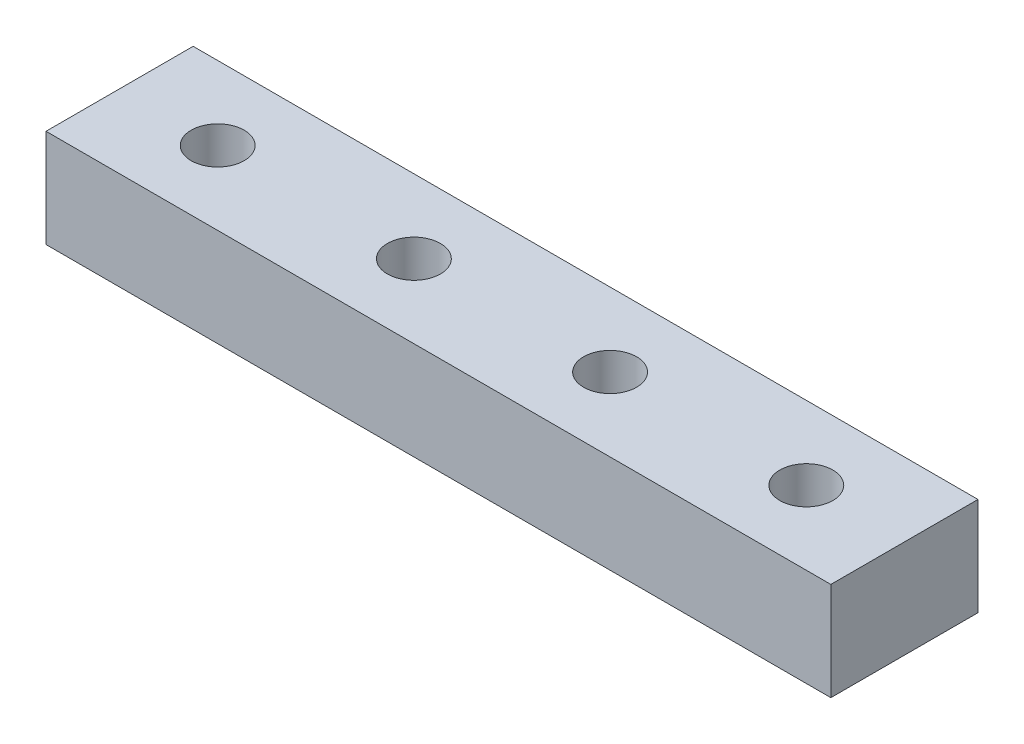
ISO-10303-21;
HEADER;
FILE_DESCRIPTION(('STEP AP214'),'2;1');
FILE_NAME('part.step','',(''),(''),'','','');
FILE_SCHEMA(('AUTOMOTIVE_DESIGN { 1 0 10303 214 1 1 1 1 }'));
ENDSEC;
DATA;
#1=APPLICATION_CONTEXT('core data for automotive mechanical design processes');
#2=APPLICATION_PROTOCOL_DEFINITION('international standard','automotive_design',2000,#1);
#3=PRODUCT_CONTEXT('',#1,'mechanical');
#4=PRODUCT('Part','Part','',(#3));
#5=PRODUCT_RELATED_PRODUCT_CATEGORY('part','',(#4));
#6=PRODUCT_DEFINITION_FORMATION('','',#4);
#7=PRODUCT_DEFINITION_CONTEXT('part definition',#1,'design');
#8=PRODUCT_DEFINITION('design','',#6,#7);
#9=PRODUCT_DEFINITION_SHAPE('','',#8);
#10=(LENGTH_UNIT() NAMED_UNIT(*) SI_UNIT(.MILLI.,.METRE.));
#11=(NAMED_UNIT(*) PLANE_ANGLE_UNIT() SI_UNIT($,.RADIAN.));
#12=(NAMED_UNIT(*) SI_UNIT($,.STERADIAN.) SOLID_ANGLE_UNIT());
#13=UNCERTAINTY_MEASURE_WITH_UNIT(LENGTH_MEASURE(1.E-05),#10,'distance_accuracy_value','');
#14=(GEOMETRIC_REPRESENTATION_CONTEXT(3) GLOBAL_UNCERTAINTY_ASSIGNED_CONTEXT((#13)) GLOBAL_UNIT_ASSIGNED_CONTEXT((#10,
#11,#12)) REPRESENTATION_CONTEXT('',''));
#15=CARTESIAN_POINT('',(0.,0.,0.));
#16=DIRECTION('',(0.,0.,1.));
#17=DIRECTION('',(1.,0.,0.));
#18=AXIS2_PLACEMENT_3D('',#15,#16,#17);
#19=CARTESIAN_POINT('',(-50.8,12.7,-19.05));
#20=DIRECTION('',(1.,0.,0.));
#21=DIRECTION('',(0.,0.,-1.));
#22=AXIS2_PLACEMENT_3D('',#19,#20,#21);
#23=PLANE('',#22);
#24=DIRECTION('',(0.,0.,1.));
#25=VECTOR('',#24,1.);
#26=CARTESIAN_POINT('',(-50.8,0.,-19.05));
#27=LINE('',#26,#25);
#28=CARTESIAN_POINT('',(-50.8,0.,-19.05));
#29=VERTEX_POINT('',#28);
#30=CARTESIAN_POINT('',(-50.8,0.,0.));
#31=VERTEX_POINT('',#30);
#32=EDGE_CURVE('E99',#29,#31,#27,.T.);
#33=ORIENTED_EDGE('',*,*,#32,.T.);
#34=DIRECTION('',(0.,-1.,0.));
#35=VECTOR('',#34,1.);
#36=CARTESIAN_POINT('',(-50.8,12.7,0.));
#37=LINE('',#36,#35);
#38=CARTESIAN_POINT('',(-50.8,12.7,0.));
#39=VERTEX_POINT('',#38);
#40=EDGE_CURVE('E11',#39,#31,#37,.T.);
#41=ORIENTED_EDGE('',*,*,#40,.F.);
#42=DIRECTION('',(0.,0.,1.));
#43=VECTOR('',#42,1.);
#44=CARTESIAN_POINT('',(-50.8,12.7,-19.05));
#45=LINE('',#44,#43);
#46=CARTESIAN_POINT('',(-50.8,12.7,-19.05));
#47=VERTEX_POINT('',#46);
#48=EDGE_CURVE('E86',#47,#39,#45,.T.);
#49=ORIENTED_EDGE('',*,*,#48,.F.);
#50=DIRECTION('',(0.,-1.,0.));
#51=VECTOR('',#50,1.);
#52=CARTESIAN_POINT('',(-50.8,12.7,-19.05));
#53=LINE('',#52,#51);
#54=EDGE_CURVE('E95',#47,#29,#53,.T.);
#55=ORIENTED_EDGE('',*,*,#54,.T.);
#56=EDGE_LOOP('',(#33,#41,#49,#55));
#57=FACE_BOUND('',#56,.T.);
#58=ADVANCED_FACE('F33',(#57),#23,.F.);
#59=CARTESIAN_POINT('',(-50.8,12.7,0.));
#60=DIRECTION('',(0.,0.,-1.));
#61=DIRECTION('',(-1.,0.,0.));
#62=AXIS2_PLACEMENT_3D('',#59,#60,#61);
#63=PLANE('',#62);
#64=DIRECTION('',(1.,0.,0.));
#65=VECTOR('',#64,1.);
#66=CARTESIAN_POINT('',(-50.8,0.,0.));
#67=LINE('',#66,#65);
#68=CARTESIAN_POINT('',(50.8,0.,0.));
#69=VERTEX_POINT('',#68);
#70=EDGE_CURVE('E90',#31,#69,#67,.T.);
#71=ORIENTED_EDGE('',*,*,#70,.T.);
#72=DIRECTION('',(0.,-1.,0.));
#73=VECTOR('',#72,1.);
#74=CARTESIAN_POINT('',(50.8,12.7,0.));
#75=LINE('',#74,#73);
#76=CARTESIAN_POINT('',(50.8,12.7,0.));
#77=VERTEX_POINT('',#76);
#78=EDGE_CURVE('E42',#77,#69,#75,.T.);
#79=ORIENTED_EDGE('',*,*,#78,.F.);
#80=DIRECTION('',(1.,0.,0.));
#81=VECTOR('',#80,1.);
#82=CARTESIAN_POINT('',(-50.8,12.7,0.));
#83=LINE('',#82,#81);
#84=EDGE_CURVE('E81',#39,#77,#83,.T.);
#85=ORIENTED_EDGE('',*,*,#84,.F.);
#86=ORIENTED_EDGE('',*,*,#40,.T.);
#87=EDGE_LOOP('',(#71,#79,#85,#86));
#88=FACE_BOUND('',#87,.T.);
#89=ADVANCED_FACE('F89',(#88),#63,.F.);
#90=CARTESIAN_POINT('',(50.8,12.7,-19.05));
#91=DIRECTION('',(-1.,0.,0.));
#92=DIRECTION('',(0.,0.,1.));
#93=AXIS2_PLACEMENT_3D('',#90,#91,#92);
#94=PLANE('',#93);
#95=DIRECTION('',(0.,0.,-1.));
#96=VECTOR('',#95,1.);
#97=CARTESIAN_POINT('',(50.8,0.,-19.05));
#98=LINE('',#97,#96);
#99=CARTESIAN_POINT('',(50.8,0.,-19.05));
#100=VERTEX_POINT('',#99);
#101=EDGE_CURVE('E68',#69,#100,#98,.T.);
#102=ORIENTED_EDGE('',*,*,#101,.T.);
#103=DIRECTION('',(0.,-1.,0.));
#104=VECTOR('',#103,1.);
#105=CARTESIAN_POINT('',(50.8,12.7,-19.05));
#106=LINE('',#105,#104);
#107=CARTESIAN_POINT('',(50.8,12.7,-19.05));
#108=VERTEX_POINT('',#107);
#109=EDGE_CURVE('E91',#108,#100,#106,.T.);
#110=ORIENTED_EDGE('',*,*,#109,.F.);
#111=DIRECTION('',(0.,0.,-1.));
#112=VECTOR('',#111,1.);
#113=CARTESIAN_POINT('',(50.8,12.7,-19.05));
#114=LINE('',#113,#112);
#115=EDGE_CURVE('E84',#77,#108,#114,.T.);
#116=ORIENTED_EDGE('',*,*,#115,.F.);
#117=ORIENTED_EDGE('',*,*,#78,.T.);
#118=EDGE_LOOP('',(#102,#110,#116,#117));
#119=FACE_BOUND('',#118,.T.);
#120=ADVANCED_FACE('F93',(#119),#94,.F.);
#121=CARTESIAN_POINT('',(-50.8,12.7,-19.05));
#122=DIRECTION('',(0.,0.,1.));
#123=DIRECTION('',(1.,0.,0.));
#124=AXIS2_PLACEMENT_3D('',#121,#122,#123);
#125=PLANE('',#124);
#126=DIRECTION('',(-1.,0.,0.));
#127=VECTOR('',#126,1.);
#128=CARTESIAN_POINT('',(-50.8,0.,-19.05));
#129=LINE('',#128,#127);
#130=EDGE_CURVE('E74',#100,#29,#129,.T.);
#131=ORIENTED_EDGE('',*,*,#130,.T.);
#132=ORIENTED_EDGE('',*,*,#54,.F.);
#133=DIRECTION('',(-1.,0.,0.));
#134=VECTOR('',#133,1.);
#135=CARTESIAN_POINT('',(-50.8,12.7,-19.05));
#136=LINE('',#135,#134);
#137=EDGE_CURVE('E51',#108,#47,#136,.T.);
#138=ORIENTED_EDGE('',*,*,#137,.F.);
#139=ORIENTED_EDGE('',*,*,#109,.T.);
#140=EDGE_LOOP('',(#131,#132,#138,#139));
#141=FACE_BOUND('',#140,.T.);
#142=ADVANCED_FACE('F145',(#141),#125,.F.);
#143=CARTESIAN_POINT('',(0.,12.7,0.));
#144=DIRECTION('',(0.,1.,0.));
#145=DIRECTION('',(0.,0.,1.));
#146=AXIS2_PLACEMENT_3D('',#143,#144,#145);
#147=PLANE('',#146);
#148=CARTESIAN_POINT('',(38.1,12.7,-9.52499999999999));
#149=DIRECTION('',(0.,1.,0.));
#150=DIRECTION('',(0.,0.,1.));
#151=AXIS2_PLACEMENT_3D('',#148,#149,#150);
#152=CIRCLE('',#151,3.429);
#153=CARTESIAN_POINT('',(38.1,12.7,-6.09599999999999));
#154=VERTEX_POINT('',#153);
#155=EDGE_CURVE('E131',#154,#154,#152,.T.);
#156=ORIENTED_EDGE('',*,*,#155,.F.);
#157=EDGE_LOOP('',(#156));
#158=FACE_BOUND('',#157,.T.);
#159=CARTESIAN_POINT('',(-12.7,12.7,-9.52499999999999));
#160=DIRECTION('',(0.,1.,0.));
#161=DIRECTION('',(0.,0.,1.));
#162=AXIS2_PLACEMENT_3D('',#159,#160,#161);
#163=CIRCLE('',#162,3.429);
#164=CARTESIAN_POINT('',(-12.7,12.7,-6.09599999999999));
#165=VERTEX_POINT('',#164);
#166=EDGE_CURVE('E114',#165,#165,#163,.T.);
#167=ORIENTED_EDGE('',*,*,#166,.F.);
#168=EDGE_LOOP('',(#167));
#169=FACE_BOUND('',#168,.T.);
#170=CARTESIAN_POINT('',(12.7,12.7,-9.52499999999999));
#171=DIRECTION('',(0.,1.,0.));
#172=DIRECTION('',(0.,0.,1.));
#173=AXIS2_PLACEMENT_3D('',#170,#171,#172);
#174=CIRCLE('',#173,3.429);
#175=CARTESIAN_POINT('',(12.7,12.7,-6.09599999999999));
#176=VERTEX_POINT('',#175);
#177=EDGE_CURVE('E109',#176,#176,#174,.T.);
#178=ORIENTED_EDGE('',*,*,#177,.F.);
#179=EDGE_LOOP('',(#178));
#180=FACE_BOUND('',#179,.T.);
#181=CARTESIAN_POINT('',(-38.1,12.7,-9.52499999999998));
#182=DIRECTION('',(0.,1.,0.));
#183=DIRECTION('',(0.,0.,1.));
#184=AXIS2_PLACEMENT_3D('',#181,#182,#183);
#185=CIRCLE('',#184,3.429);
#186=CARTESIAN_POINT('',(-38.1,12.7,-6.09599999999999));
#187=VERTEX_POINT('',#186);
#188=EDGE_CURVE('E130',#187,#187,#185,.T.);
#189=ORIENTED_EDGE('',*,*,#188,.F.);
#190=EDGE_LOOP('',(#189));
#191=FACE_BOUND('',#190,.T.);
#192=ORIENTED_EDGE('',*,*,#48,.T.);
#193=ORIENTED_EDGE('',*,*,#84,.T.);
#194=ORIENTED_EDGE('',*,*,#115,.T.);
#195=ORIENTED_EDGE('',*,*,#137,.T.);
#196=EDGE_LOOP('',(#192,#193,#194,#195));
#197=FACE_BOUND('',#196,.T.);
#198=ADVANCED_FACE('F82',(#158,#169,#180,#191,#197),#147,.T.);
#199=CARTESIAN_POINT('',(0.,0.,0.));
#200=DIRECTION('',(0.,1.,0.));
#201=DIRECTION('',(0.,0.,1.));
#202=AXIS2_PLACEMENT_3D('',#199,#200,#201);
#203=PLANE('',#202);
#204=CARTESIAN_POINT('',(12.7,0.,-9.52499999999999));
#205=DIRECTION('',(0.,1.,0.));
#206=DIRECTION('',(0.,0.,1.));
#207=AXIS2_PLACEMENT_3D('',#204,#205,#206);
#208=CIRCLE('',#207,6.604);
#209=CARTESIAN_POINT('',(12.7,0.,-2.92099999999999));
#210=VERTEX_POINT('',#209);
#211=EDGE_CURVE('E124',#210,#210,#208,.T.);
#212=ORIENTED_EDGE('',*,*,#211,.T.);
#213=EDGE_LOOP('',(#212));
#214=FACE_BOUND('',#213,.T.);
#215=CARTESIAN_POINT('',(-12.7,0.,-9.52499999999999));
#216=DIRECTION('',(0.,1.,0.));
#217=DIRECTION('',(0.,0.,1.));
#218=AXIS2_PLACEMENT_3D('',#215,#216,#217);
#219=CIRCLE('',#218,6.604);
#220=CARTESIAN_POINT('',(-12.7,0.,-2.92099999999999));
#221=VERTEX_POINT('',#220);
#222=EDGE_CURVE('E117',#221,#221,#219,.T.);
#223=ORIENTED_EDGE('',*,*,#222,.T.);
#224=EDGE_LOOP('',(#223));
#225=FACE_BOUND('',#224,.T.);
#226=CARTESIAN_POINT('',(38.1,0.,-9.52499999999999));
#227=DIRECTION('',(0.,1.,0.));
#228=DIRECTION('',(0.,0.,1.));
#229=AXIS2_PLACEMENT_3D('',#226,#227,#228);
#230=CIRCLE('',#229,3.429);
#231=CARTESIAN_POINT('',(38.1,0.,-6.09599999999999));
#232=VERTEX_POINT('',#231);
#233=EDGE_CURVE('E127',#232,#232,#230,.T.);
#234=ORIENTED_EDGE('',*,*,#233,.T.);
#235=EDGE_LOOP('',(#234));
#236=FACE_BOUND('',#235,.T.);
#237=CARTESIAN_POINT('',(-38.1,0.,-9.52499999999998));
#238=DIRECTION('',(0.,1.,0.));
#239=DIRECTION('',(0.,0.,1.));
#240=AXIS2_PLACEMENT_3D('',#237,#238,#239);
#241=CIRCLE('',#240,3.429);
#242=CARTESIAN_POINT('',(-38.1,0.,-6.09599999999999));
#243=VERTEX_POINT('',#242);
#244=EDGE_CURVE('E102',#243,#243,#241,.T.);
#245=ORIENTED_EDGE('',*,*,#244,.T.);
#246=EDGE_LOOP('',(#245));
#247=FACE_BOUND('',#246,.T.);
#248=ORIENTED_EDGE('',*,*,#32,.F.);
#249=ORIENTED_EDGE('',*,*,#130,.F.);
#250=ORIENTED_EDGE('',*,*,#101,.F.);
#251=ORIENTED_EDGE('',*,*,#70,.F.);
#252=EDGE_LOOP('',(#248,#249,#250,#251));
#253=FACE_BOUND('',#252,.T.);
#254=ADVANCED_FACE('F144',(#214,#225,#236,#247,#253),#203,.F.);
#255=CARTESIAN_POINT('',(-38.1,0.,-9.52499999999998));
#256=DIRECTION('',(0.,1.,0.));
#257=DIRECTION('',(0.,0.,1.));
#258=AXIS2_PLACEMENT_3D('',#255,#256,#257);
#259=CYLINDRICAL_SURFACE('',#258,3.429);
#260=ORIENTED_EDGE('',*,*,#244,.F.);
#261=EDGE_LOOP('',(#260));
#262=FACE_BOUND('',#261,.T.);
#263=ORIENTED_EDGE('',*,*,#188,.T.);
#264=EDGE_LOOP('',(#263));
#265=FACE_BOUND('',#264,.T.);
#266=ADVANCED_FACE('F141',(#262,#265),#259,.F.);
#267=CARTESIAN_POINT('',(12.7,0.,-9.52499999999999));
#268=DIRECTION('',(0.,1.,0.));
#269=DIRECTION('',(0.,0.,1.));
#270=AXIS2_PLACEMENT_3D('',#267,#268,#269);
#271=CYLINDRICAL_SURFACE('',#270,3.429);
#272=CARTESIAN_POINT('',(12.7,6.985,-9.52499999999999));
#273=DIRECTION('',(0.,1.,0.));
#274=DIRECTION('',(0.,0.,1.));
#275=AXIS2_PLACEMENT_3D('',#272,#273,#274);
#276=CIRCLE('',#275,3.429);
#277=CARTESIAN_POINT('',(12.7,6.985,-6.09599999999999));
#278=VERTEX_POINT('',#277);
#279=EDGE_CURVE('E36',#278,#278,#276,.F.);
#280=ORIENTED_EDGE('',*,*,#279,.T.);
#281=EDGE_LOOP('',(#280));
#282=FACE_BOUND('',#281,.T.);
#283=ORIENTED_EDGE('',*,*,#177,.T.);
#284=EDGE_LOOP('',(#283));
#285=FACE_BOUND('',#284,.T.);
#286=ADVANCED_FACE('F189',(#282,#285),#271,.F.);
#287=CARTESIAN_POINT('',(-12.7,0.,-9.52499999999999));
#288=DIRECTION('',(0.,1.,0.));
#289=DIRECTION('',(0.,0.,1.));
#290=AXIS2_PLACEMENT_3D('',#287,#288,#289);
#291=CYLINDRICAL_SURFACE('',#290,3.429);
#292=CARTESIAN_POINT('',(-12.7,6.985,-9.52499999999999));
#293=DIRECTION('',(0.,1.,0.));
#294=DIRECTION('',(0.,0.,1.));
#295=AXIS2_PLACEMENT_3D('',#292,#293,#294);
#296=CIRCLE('',#295,3.429);
#297=CARTESIAN_POINT('',(-12.7,6.985,-6.09599999999999));
#298=VERTEX_POINT('',#297);
#299=EDGE_CURVE('E107',#298,#298,#296,.F.);
#300=ORIENTED_EDGE('',*,*,#299,.T.);
#301=EDGE_LOOP('',(#300));
#302=FACE_BOUND('',#301,.T.);
#303=ORIENTED_EDGE('',*,*,#166,.T.);
#304=EDGE_LOOP('',(#303));
#305=FACE_BOUND('',#304,.T.);
#306=ADVANCED_FACE('F202',(#302,#305),#291,.F.);
#307=CARTESIAN_POINT('',(38.1,0.,-9.52499999999999));
#308=DIRECTION('',(0.,1.,0.));
#309=DIRECTION('',(0.,0.,1.));
#310=AXIS2_PLACEMENT_3D('',#307,#308,#309);
#311=CYLINDRICAL_SURFACE('',#310,3.429);
#312=ORIENTED_EDGE('',*,*,#233,.F.);
#313=EDGE_LOOP('',(#312));
#314=FACE_BOUND('',#313,.T.);
#315=ORIENTED_EDGE('',*,*,#155,.T.);
#316=EDGE_LOOP('',(#315));
#317=FACE_BOUND('',#316,.T.);
#318=ADVANCED_FACE('F196',(#314,#317),#311,.F.);
#319=CARTESIAN_POINT('',(-12.7,6.985,-9.52499999999999));
#320=DIRECTION('',(0.,1.,0.));
#321=DIRECTION('',(0.,0.,1.));
#322=AXIS2_PLACEMENT_3D('',#319,#320,#321);
#323=PLANE('',#322);
#324=CARTESIAN_POINT('',(-12.7,6.985,-9.52499999999999));
#325=DIRECTION('',(0.,1.,0.));
#326=DIRECTION('',(0.,0.,1.));
#327=AXIS2_PLACEMENT_3D('',#324,#325,#326);
#328=CIRCLE('',#327,6.604);
#329=CARTESIAN_POINT('',(-12.7,6.985,-2.92099999999999));
#330=VERTEX_POINT('',#329);
#331=EDGE_CURVE('E110',#330,#330,#328,.T.);
#332=ORIENTED_EDGE('',*,*,#331,.F.);
#333=EDGE_LOOP('',(#332));
#334=FACE_BOUND('',#333,.T.);
#335=ORIENTED_EDGE('',*,*,#299,.F.);
#336=EDGE_LOOP('',(#335));
#337=FACE_BOUND('',#336,.T.);
#338=ADVANCED_FACE('F201',(#334,#337),#323,.F.);
#339=CARTESIAN_POINT('',(-12.7,6.985,-9.52499999999999));
#340=DIRECTION('',(0.,-1.,0.));
#341=DIRECTION('',(0.,0.,-1.));
#342=AXIS2_PLACEMENT_3D('',#339,#340,#341);
#343=CYLINDRICAL_SURFACE('',#342,6.604);
#344=ORIENTED_EDGE('',*,*,#331,.T.);
#345=EDGE_LOOP('',(#344));
#346=FACE_BOUND('',#345,.T.);
#347=ORIENTED_EDGE('',*,*,#222,.F.);
#348=EDGE_LOOP('',(#347));
#349=FACE_BOUND('',#348,.T.);
#350=ADVANCED_FACE('F232',(#346,#349),#343,.F.);
#351=CARTESIAN_POINT('',(12.7,6.985,-9.52499999999999));
#352=DIRECTION('',(0.,1.,0.));
#353=DIRECTION('',(0.,0.,1.));
#354=AXIS2_PLACEMENT_3D('',#351,#352,#353);
#355=PLANE('',#354);
#356=CARTESIAN_POINT('',(12.7,6.985,-9.52499999999999));
#357=DIRECTION('',(0.,1.,0.));
#358=DIRECTION('',(0.,0.,1.));
#359=AXIS2_PLACEMENT_3D('',#356,#357,#358);
#360=CIRCLE('',#359,6.604);
#361=CARTESIAN_POINT('',(12.7,6.985,-2.92099999999999));
#362=VERTEX_POINT('',#361);
#363=EDGE_CURVE('E268',#362,#362,#360,.T.);
#364=ORIENTED_EDGE('',*,*,#363,.F.);
#365=EDGE_LOOP('',(#364));
#366=FACE_BOUND('',#365,.T.);
#367=ORIENTED_EDGE('',*,*,#279,.F.);
#368=EDGE_LOOP('',(#367));
#369=FACE_BOUND('',#368,.T.);
#370=ADVANCED_FACE('F242',(#366,#369),#355,.F.);
#371=CARTESIAN_POINT('',(12.7,6.985,-9.52499999999999));
#372=DIRECTION('',(0.,-1.,0.));
#373=DIRECTION('',(0.,0.,-1.));
#374=AXIS2_PLACEMENT_3D('',#371,#372,#373);
#375=CYLINDRICAL_SURFACE('',#374,6.604);
#376=ORIENTED_EDGE('',*,*,#363,.T.);
#377=EDGE_LOOP('',(#376));
#378=FACE_BOUND('',#377,.T.);
#379=ORIENTED_EDGE('',*,*,#211,.F.);
#380=EDGE_LOOP('',(#379));
#381=FACE_BOUND('',#380,.T.);
#382=ADVANCED_FACE('F251',(#378,#381),#375,.F.);
#383=CLOSED_SHELL('',(#58,#89,#120,#142,#198,#254,#266,#286,#306,#318,#338,#350,#370,#382));
#384=MANIFOLD_SOLID_BREP('B2',#383);
#385=ADVANCED_BREP_SHAPE_REPRESENTATION('',(#18,#384),#14);
#386=SHAPE_DEFINITION_REPRESENTATION(#9,#385);
ENDSEC;
END-ISO-10303-21;
